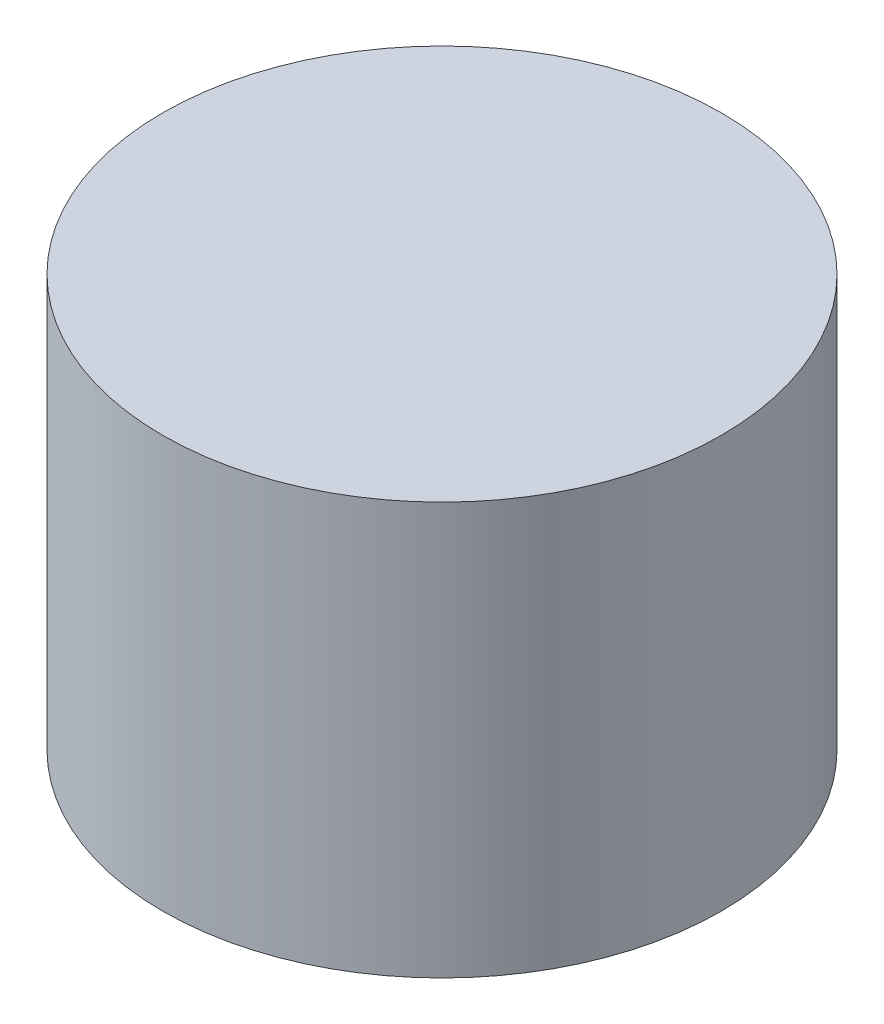
ISO-10303-21;
HEADER;
FILE_DESCRIPTION(('STEP AP214'),'2;1');
FILE_NAME('part.step','',(''),(''),'','','');
FILE_SCHEMA(('AUTOMOTIVE_DESIGN { 1 0 10303 214 1 1 1 1 }'));
ENDSEC;
DATA;
#1=APPLICATION_CONTEXT('core data for automotive mechanical design processes');
#2=APPLICATION_PROTOCOL_DEFINITION('international standard','automotive_design',2000,#1);
#3=PRODUCT_CONTEXT('',#1,'mechanical');
#4=PRODUCT('Part','Part','',(#3));
#5=PRODUCT_RELATED_PRODUCT_CATEGORY('part','',(#4));
#6=PRODUCT_DEFINITION_FORMATION('','',#4);
#7=PRODUCT_DEFINITION_CONTEXT('part definition',#1,'design');
#8=PRODUCT_DEFINITION('design','',#6,#7);
#9=PRODUCT_DEFINITION_SHAPE('','',#8);
#10=(LENGTH_UNIT() NAMED_UNIT(*) SI_UNIT(.MILLI.,.METRE.));
#11=(NAMED_UNIT(*) PLANE_ANGLE_UNIT() SI_UNIT($,.RADIAN.));
#12=(NAMED_UNIT(*) SI_UNIT($,.STERADIAN.) SOLID_ANGLE_UNIT());
#13=UNCERTAINTY_MEASURE_WITH_UNIT(LENGTH_MEASURE(1.E-05),#10,'distance_accuracy_value','');
#14=(GEOMETRIC_REPRESENTATION_CONTEXT(3) GLOBAL_UNCERTAINTY_ASSIGNED_CONTEXT((#13)) GLOBAL_UNIT_ASSIGNED_CONTEXT((#10,
#11,#12)) REPRESENTATION_CONTEXT('',''));
#15=CARTESIAN_POINT('',(0.,0.,0.));
#16=DIRECTION('',(0.,0.,1.));
#17=DIRECTION('',(1.,0.,0.));
#18=AXIS2_PLACEMENT_3D('',#15,#16,#17);
#19=CARTESIAN_POINT('',(0.,76.2,0.));
#20=DIRECTION('',(0.,-1.,0.));
#21=DIRECTION('',(0.,0.,-1.));
#22=AXIS2_PLACEMENT_3D('',#19,#20,#21);
#23=CYLINDRICAL_SURFACE('',#22,51.65);
#24=CARTESIAN_POINT('',(0.,76.2,0.));
#25=DIRECTION('',(0.,1.,0.));
#26=DIRECTION('',(0.,0.,1.));
#27=AXIS2_PLACEMENT_3D('',#24,#25,#26);
#28=CIRCLE('',#27,51.65);
#29=CARTESIAN_POINT('',(0.,76.2,-51.65));
#30=VERTEX_POINT('',#29);
#31=EDGE_CURVE('E10',#30,#30,#28,.T.);
#32=CARTESIAN_POINT('',(0.,0.,0.));
#33=DIRECTION('',(0.,1.,0.));
#34=DIRECTION('',(0.,0.,1.));
#35=AXIS2_PLACEMENT_3D('',#32,#33,#34);
#36=CIRCLE('',#35,51.65);
#37=CARTESIAN_POINT('',(0.,0.,-51.65));
#38=VERTEX_POINT('',#37);
#39=EDGE_CURVE('E44',#38,#38,#36,.T.);
#40=CARTESIAN_POINT('',(0.,76.2,-51.65));
#41=CARTESIAN_POINT('',(0.,75.40625,-51.65));
#42=CARTESIAN_POINT('',(0.,74.6125,-51.65));
#43=CARTESIAN_POINT('',(0.,73.025,-51.65));
#44=CARTESIAN_POINT('',(0.,72.23125,-51.65));
#45=CARTESIAN_POINT('',(0.,70.64375,-51.65));
#46=CARTESIAN_POINT('',(0.,69.85,-51.65));
#47=CARTESIAN_POINT('',(0.,68.2625,-51.65));
#48=CARTESIAN_POINT('',(0.,67.46875,-51.65));
#49=CARTESIAN_POINT('',(0.,65.88125,-51.65));
#50=CARTESIAN_POINT('',(0.,65.0875,-51.65));
#51=CARTESIAN_POINT('',(0.,63.5,-51.65));
#52=CARTESIAN_POINT('',(0.,62.70625,-51.65));
#53=CARTESIAN_POINT('',(0.,61.11875,-51.65));
#54=CARTESIAN_POINT('',(0.,60.325,-51.65));
#55=CARTESIAN_POINT('',(0.,58.7375,-51.65));
#56=CARTESIAN_POINT('',(0.,57.94375,-51.65));
#57=CARTESIAN_POINT('',(0.,56.35625,-51.65));
#58=CARTESIAN_POINT('',(0.,55.5625,-51.65));
#59=CARTESIAN_POINT('',(0.,53.975,-51.65));
#60=CARTESIAN_POINT('',(0.,53.18125,-51.65));
#61=CARTESIAN_POINT('',(0.,51.59375,-51.65));
#62=CARTESIAN_POINT('',(0.,50.8,-51.65));
#63=CARTESIAN_POINT('',(0.,49.2125,-51.65));
#64=CARTESIAN_POINT('',(0.,48.41875,-51.65));
#65=CARTESIAN_POINT('',(0.,46.83125,-51.65));
#66=CARTESIAN_POINT('',(0.,46.0375,-51.65));
#67=CARTESIAN_POINT('',(0.,44.45,-51.65));
#68=CARTESIAN_POINT('',(0.,43.65625,-51.65));
#69=CARTESIAN_POINT('',(0.,42.06875,-51.65));
#70=CARTESIAN_POINT('',(0.,41.275,-51.65));
#71=CARTESIAN_POINT('',(0.,39.6875,-51.65));
#72=CARTESIAN_POINT('',(0.,38.89375,-51.65));
#73=CARTESIAN_POINT('',(0.,37.30625,-51.65));
#74=CARTESIAN_POINT('',(0.,36.5125,-51.65));
#75=CARTESIAN_POINT('',(0.,34.925,-51.65));
#76=CARTESIAN_POINT('',(0.,34.13125,-51.65));
#77=CARTESIAN_POINT('',(0.,32.54375,-51.65));
#78=CARTESIAN_POINT('',(0.,31.75,-51.65));
#79=CARTESIAN_POINT('',(0.,30.1625,-51.65));
#80=CARTESIAN_POINT('',(0.,29.36875,-51.65));
#81=CARTESIAN_POINT('',(0.,27.78125,-51.65));
#82=CARTESIAN_POINT('',(0.,26.9875,-51.65));
#83=CARTESIAN_POINT('',(0.,25.4,-51.65));
#84=CARTESIAN_POINT('',(0.,24.60625,-51.65));
#85=CARTESIAN_POINT('',(0.,23.01875,-51.65));
#86=CARTESIAN_POINT('',(0.,22.225,-51.65));
#87=CARTESIAN_POINT('',(0.,20.6375,-51.65));
#88=CARTESIAN_POINT('',(0.,19.84375,-51.65));
#89=CARTESIAN_POINT('',(0.,18.25625,-51.65));
#90=CARTESIAN_POINT('',(0.,17.4625,-51.65));
#91=CARTESIAN_POINT('',(0.,15.875,-51.65));
#92=CARTESIAN_POINT('',(0.,15.08125,-51.65));
#93=CARTESIAN_POINT('',(0.,13.49375,-51.65));
#94=CARTESIAN_POINT('',(0.,12.7,-51.65));
#95=CARTESIAN_POINT('',(0.,11.1125,-51.65));
#96=CARTESIAN_POINT('',(0.,10.31875,-51.65));
#97=CARTESIAN_POINT('',(0.,8.73125,-51.65));
#98=CARTESIAN_POINT('',(0.,7.93750000000001,-51.65));
#99=CARTESIAN_POINT('',(0.,6.35,-51.65));
#100=CARTESIAN_POINT('',(0.,5.55625,-51.65));
#101=CARTESIAN_POINT('',(0.,3.96875,-51.65));
#102=CARTESIAN_POINT('',(0.,3.175,-51.65));
#103=CARTESIAN_POINT('',(0.,1.5875,-51.65));
#104=CARTESIAN_POINT('',(0.,0.793750000000001,-51.65));
#105=CARTESIAN_POINT('',(0.,0.,-51.65));
#106=B_SPLINE_CURVE_WITH_KNOTS('',3,(#40,#41,#42,#43,#44,#45,#46,#47,#48,#49,#50,#51,#52,#53,
#54,#55,#56,#57,#58,#59,#60,#61,#62,#63,#64,#65,#66,#67,#68,#69,#70,#71,#72,#73,#74,#75,#76,#77,
#78,#79,#80,#81,#82,#83,#84,#85,#86,#87,#88,#89,#90,#91,#92,#93,#94,#95,#96,#97,#98,#99,#100,
#101,#102,#103,#104,#105),.UNSPECIFIED.,.F.,.F.,(4,2,2,2,2,2,2,2,2,2,2,2,2,2,2,2,2,2,2,2,2,2,2,
2,2,2,2,2,2,2,2,2,4),(0.,2.38125,4.7625,7.14375,9.52500000000001,11.90625,14.2875,16.66875,
19.05,21.43125,23.8125,26.19375,28.575,30.95625,33.3375,35.71875,38.1,40.48125,42.8625,45.24375,
47.625,50.00625,52.3875,54.76875,57.15,59.53125,61.9125,64.29375,66.675,69.05625,71.4375,
73.81875,76.2),.UNSPECIFIED.);
#107=EDGE_CURVE('BSEAM41',#30,#38,#106,.T.);
#108=ORIENTED_EDGE('',*,*,#31,.F.);
#109=ORIENTED_EDGE('',*,*,#39,.T.);
#110=ORIENTED_EDGE('',*,*,#107,.T.);
#111=ORIENTED_EDGE('',*,*,#107,.F.);
#112=EDGE_LOOP('',(#108,#110,#109,#111));
#113=FACE_BOUND('',#112,.T.);
#114=ADVANCED_FACE('F41',(#113),#23,.T.);
#115=CARTESIAN_POINT('',(0.,76.2,0.));
#116=DIRECTION('',(0.,1.,0.));
#117=DIRECTION('',(0.,0.,1.));
#118=AXIS2_PLACEMENT_3D('',#115,#116,#117);
#119=PLANE('',#118);
#120=ORIENTED_EDGE('',*,*,#31,.T.);
#121=EDGE_LOOP('',(#120));
#122=FACE_BOUND('',#121,.T.);
#123=ADVANCED_FACE('F56',(#122),#119,.T.);
#124=CARTESIAN_POINT('',(0.,0.,0.));
#125=DIRECTION('',(0.,1.,0.));
#126=DIRECTION('',(0.,0.,1.));
#127=AXIS2_PLACEMENT_3D('',#124,#125,#126);
#128=PLANE('',#127);
#129=ORIENTED_EDGE('',*,*,#39,.F.);
#130=EDGE_LOOP('',(#129));
#131=FACE_BOUND('',#130,.T.);
#132=ADVANCED_FACE('F54',(#131),#128,.F.);
#133=CLOSED_SHELL('',(#114,#123,#132));
#134=MANIFOLD_SOLID_BREP('B2',#133);
#135=ADVANCED_BREP_SHAPE_REPRESENTATION('',(#18,#134),#14);
#136=SHAPE_DEFINITION_REPRESENTATION(#9,#135);
ENDSEC;
END-ISO-10303-21;
